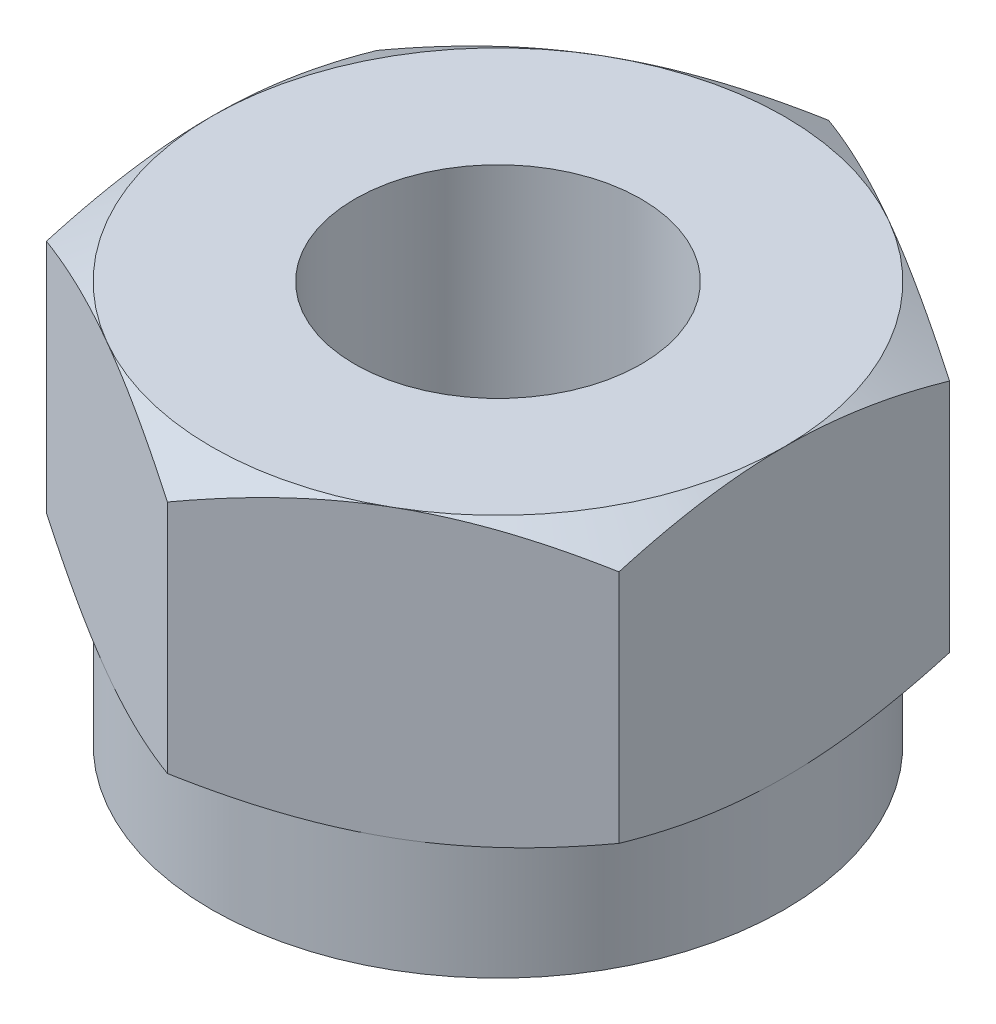
ISO-10303-21;
HEADER;
FILE_DESCRIPTION(('STEP AP214'),'2;1');
FILE_NAME('part.step','',(''),(''),'','','');
FILE_SCHEMA(('AUTOMOTIVE_DESIGN { 1 0 10303 214 1 1 1 1 }'));
ENDSEC;
DATA;
#1=APPLICATION_CONTEXT('core data for automotive mechanical design processes');
#2=APPLICATION_PROTOCOL_DEFINITION('international standard','automotive_design',2000,#1);
#3=PRODUCT_CONTEXT('',#1,'mechanical');
#4=PRODUCT('Part','Part','',(#3));
#5=PRODUCT_RELATED_PRODUCT_CATEGORY('part','',(#4));
#6=PRODUCT_DEFINITION_FORMATION('','',#4);
#7=PRODUCT_DEFINITION_CONTEXT('part definition',#1,'design');
#8=PRODUCT_DEFINITION('design','',#6,#7);
#9=PRODUCT_DEFINITION_SHAPE('','',#8);
#10=(LENGTH_UNIT() NAMED_UNIT(*) SI_UNIT(.MILLI.,.METRE.));
#11=(NAMED_UNIT(*) PLANE_ANGLE_UNIT() SI_UNIT($,.RADIAN.));
#12=(NAMED_UNIT(*) SI_UNIT($,.STERADIAN.) SOLID_ANGLE_UNIT());
#13=UNCERTAINTY_MEASURE_WITH_UNIT(LENGTH_MEASURE(1.E-05),#10,'distance_accuracy_value','');
#14=(GEOMETRIC_REPRESENTATION_CONTEXT(3) GLOBAL_UNCERTAINTY_ASSIGNED_CONTEXT((#13)) GLOBAL_UNIT_ASSIGNED_CONTEXT((#10,
#11,#12)) REPRESENTATION_CONTEXT('',''));
#15=CARTESIAN_POINT('',(0.,0.,0.));
#16=DIRECTION('',(0.,0.,1.));
#17=DIRECTION('',(1.,0.,0.));
#18=AXIS2_PLACEMENT_3D('',#15,#16,#17);
#19=CARTESIAN_POINT('',(2.,2.,1.15470053837925));
#20=DIRECTION('',(-1.,0.,0.));
#21=DIRECTION('',(0.,0.,1.));
#22=AXIS2_PLACEMENT_3D('',#19,#20,#21);
#23=PLANE('',#22);
#24=CARTESIAN_POINT('',(2.,0.97875609535379,-3.10723536669795));
#25=CARTESIAN_POINT('',(2.,0.936330863281514,-3.01982291812541));
#26=CARTESIAN_POINT('',(2.,0.894310863129675,-2.93221037868432));
#27=CARTESIAN_POINT('',(2.,0.811309168985699,-2.75647870830455));
#28=CARTESIAN_POINT('',(2.,0.770327637652085,-2.66835950062464));
#29=CARTESIAN_POINT('',(2.,0.689425807534132,-2.49105688438225));
#30=CARTESIAN_POINT('',(2.,0.649512450293482,-2.40187029751415));
#31=CARTESIAN_POINT('',(2.,0.571312094711017,-2.22278956259598));
#32=CARTESIAN_POINT('',(2.,0.533025019831961,-2.1328954480806));
#33=CARTESIAN_POINT('',(2.,0.457311353013554,-1.94935956339698));
#34=CARTESIAN_POINT('',(2.,0.419951688652782,-1.85569003279897));
#35=CARTESIAN_POINT('',(2.,0.34804642810297,-1.66725722614894));
#36=CARTESIAN_POINT('',(2.,0.313501146828968,-1.5724938290496));
#37=CARTESIAN_POINT('',(2.,0.248127262335514,-1.38189797826887));
#38=CARTESIAN_POINT('',(2.,0.217291190172754,-1.2860681123297));
#39=CARTESIAN_POINT('',(2.,0.160321349989198,-1.09303393166713));
#40=CARTESIAN_POINT('',(2.,0.134186107409679,-0.995830058298591));
#41=CARTESIAN_POINT('',(2.,0.0880046638202396,-0.800519631570152));
#42=CARTESIAN_POINT('',(2.,0.0679260461446227,-0.70242088760782));
#43=CARTESIAN_POINT('',(2.,0.0349927806511479,-0.504998657712038));
#44=CARTESIAN_POINT('',(2.,0.0221374160455011,-0.405675294301689));
#45=CARTESIAN_POINT('',(2.,0.00484760333100289,-0.207596358357077));
#46=CARTESIAN_POINT('',(2.,0.000304399834046033,-0.108850556253254));
#47=CARTESIAN_POINT('',(2.,-0.000274990538612941,0.0886636689890182));
#48=CARTESIAN_POINT('',(2.,0.00368903604231219,0.187432092632895));
#49=CARTESIAN_POINT('',(2.,0.0230279822384194,0.424007908884412));
#50=CARTESIAN_POINT('',(2.,0.0423603458053589,0.561494039208795));
#51=CARTESIAN_POINT('',(2.,0.0941420038497051,0.833973970245911));
#52=CARTESIAN_POINT('',(2.,0.126603821924047,0.968965262326356));
#53=CARTESIAN_POINT('',(2.,0.201944047933827,1.23927661555394));
#54=CARTESIAN_POINT('',(2.,0.245044073278131,1.37453334862926));
#55=CARTESIAN_POINT('',(2.,0.314931252091322,1.57552896046736));
#56=CARTESIAN_POINT('',(2.,0.339097251369915,1.64220624190891));
#57=CARTESIAN_POINT('',(2.,0.388899908545845,1.77500960503274));
#58=CARTESIAN_POINT('',(2.,0.414536540487428,1.84113569641962));
#59=CARTESIAN_POINT('',(2.,0.481768746671531,2.00988825558346));
#60=CARTESIAN_POINT('',(2.,0.524243277022574,2.11216361199275));
#61=CARTESIAN_POINT('',(2.,0.61146610883818,2.31574315029396));
#62=CARTESIAN_POINT('',(2.,0.656214597629618,2.41704725135485));
#63=CARTESIAN_POINT('',(2.,0.793084875117166,2.71983538558203));
#64=CARTESIAN_POINT('',(2.,0.887808948944017,2.92014047757868));
#65=CARTESIAN_POINT('',(2.,1.08164958392909,3.31892342327748));
#66=CARTESIAN_POINT('',(2.,1.18077193970127,3.51739842372691));
#67=CARTESIAN_POINT('',(2.,1.38182194195776,3.91287779107638));
#68=CARTESIAN_POINT('',(2.,1.48374912223979,4.10988239553973));
#69=CARTESIAN_POINT('',(2.,1.67962496570404,4.4839452837697));
#70=CARTESIAN_POINT('',(2.,1.77339629282093,4.66109678031435));
#71=CARTESIAN_POINT('',(2.,1.96210959646804,5.01478564375816));
#72=CARTESIAN_POINT('',(2.,2.05705162974282,5.19132298035281));
#73=CARTESIAN_POINT('',(2.,2.24753342568951,5.54340746049773));
#74=CARTESIAN_POINT('',(2.,2.34307063018964,5.71895599006594));
#75=CARTESIAN_POINT('',(2.,2.53482345307692,6.06966713410512));
#76=CARTESIAN_POINT('',(2.,2.63103902593319,6.24482977345991));
#77=CARTESIAN_POINT('',(2.,2.72750366307915,6.41985423397319));
#78=B_SPLINE_CURVE_WITH_KNOTS('',3,(#24,#25,#26,#27,#28,#29,#30,#31,#32,#33,#34,#35,#36,#37,#38,
#39,#40,#41,#42,#43,#44,#45,#46,#47,#48,#49,#50,#51,#52,#53,#54,#55,#56,#57,#58,#59,#60,#61,#62,
#63,#64,#65,#66,#67,#68,#69,#70,#71,#72,#73,#74,#75,#76,#77),.UNSPECIFIED.,.F.,.F.,(4,2,2,2,2,2,
2,2,2,2,2,2,2,2,2,2,2,2,2,2,2,2,2,2,2,2,4),(0.,0.291495438242345,0.583036255555676,
0.876154468354256,1.16925887089875,1.47175908403472,1.77429309903688,2.07620734835897,
2.37802672726573,2.67820079164995,2.9783450634853,3.27453340244007,3.57072917320313,
3.98638730647848,4.40244285594601,4.828030774266,5.04078368912382,5.25353285017925,
5.58572764746253,5.91794985519123,6.58257182839213,7.24809704982038,7.91351231168527,
8.51482375441764,9.11616445840593,9.7157475317989,10.3152907382448),.UNSPECIFIED.);
#79=CARTESIAN_POINT('',(2.,0.178632794953898,-1.15470053837953));
#80=VERTEX_POINT('',#79);
#81=CARTESIAN_POINT('',(2.,0.,0.));
#82=VERTEX_POINT('',#81);
#83=EDGE_CURVE('E156',#80,#82,#78,.T.);
#84=ORIENTED_EDGE('',*,*,#83,.F.);
#85=DIRECTION('',(0.,-1.,0.));
#86=VECTOR('',#85,1.);
#87=CARTESIAN_POINT('',(2.,2.,-1.15470053837925));
#88=LINE('',#87,#86);
#89=CARTESIAN_POINT('',(2.,1.82136720504592,-1.15470053837925));
#90=VERTEX_POINT('',#89);
#91=EDGE_CURVE('E164',#90,#80,#88,.T.);
#92=ORIENTED_EDGE('',*,*,#91,.F.);
#93=CARTESIAN_POINT('',(2.,1.02124390464623,-3.10723536669795));
#94=CARTESIAN_POINT('',(2.,1.0636691367185,-3.01982291812541));
#95=CARTESIAN_POINT('',(2.,1.10568913687034,-2.93221037868432));
#96=CARTESIAN_POINT('',(2.,1.18869083101432,-2.75647870830454));
#97=CARTESIAN_POINT('',(2.,1.22967236234793,-2.66835950062463));
#98=CARTESIAN_POINT('',(2.,1.31057419246588,-2.49105688438224));
#99=CARTESIAN_POINT('',(2.,1.35048754970653,-2.40187029751414));
#100=CARTESIAN_POINT('',(2.,1.42868790528899,-2.22278956259597));
#101=CARTESIAN_POINT('',(2.,1.46697498016805,-2.1328954480806));
#102=CARTESIAN_POINT('',(2.,1.54268864698646,-1.94935956339698));
#103=CARTESIAN_POINT('',(2.,1.58004831134723,-1.85569003279897));
#104=CARTESIAN_POINT('',(2.,1.65195357189704,-1.66725722614894));
#105=CARTESIAN_POINT('',(2.,1.68649885317104,-1.5724938290496));
#106=CARTESIAN_POINT('',(2.,1.75187273766449,-1.38189797826887));
#107=CARTESIAN_POINT('',(2.,1.78270880982725,-1.2860681123297));
#108=CARTESIAN_POINT('',(2.,1.83967865001081,-1.09303393166713));
#109=CARTESIAN_POINT('',(2.,1.86581389259032,-0.995830058298589));
#110=CARTESIAN_POINT('',(2.,1.91199533617976,-0.80051963157015));
#111=CARTESIAN_POINT('',(2.,1.93207395385538,-0.702420887607818));
#112=CARTESIAN_POINT('',(2.,1.96500721934885,-0.504998657712038));
#113=CARTESIAN_POINT('',(2.,1.9778625839545,-0.405675294301688));
#114=CARTESIAN_POINT('',(2.,1.995152396669,-0.207596358357078));
#115=CARTESIAN_POINT('',(2.,1.99969560016595,-0.108850556253255));
#116=CARTESIAN_POINT('',(2.,2.00027499053861,0.0886636689890171));
#117=CARTESIAN_POINT('',(2.,1.99631096395769,0.187432092632894));
#118=CARTESIAN_POINT('',(2.,1.97697201776158,0.424007908884413));
#119=CARTESIAN_POINT('',(2.,1.95763965419464,0.561494039208799));
#120=CARTESIAN_POINT('',(2.,1.90585799615029,0.83397397024592));
#121=CARTESIAN_POINT('',(2.,1.87339617807595,0.968965262326369));
#122=CARTESIAN_POINT('',(2.,1.79805595206617,1.23927661555396));
#123=CARTESIAN_POINT('',(2.,1.75495592672187,1.37453334862928));
#124=CARTESIAN_POINT('',(2.,1.68506874790868,1.57552896046739));
#125=CARTESIAN_POINT('',(2.,1.66090274863008,1.64220624190893));
#126=CARTESIAN_POINT('',(2.,1.61110009145415,1.77500960503277));
#127=CARTESIAN_POINT('',(2.,1.58546345951257,1.84113569641965));
#128=CARTESIAN_POINT('',(2.,1.51823125332846,2.00988825558349));
#129=CARTESIAN_POINT('',(2.,1.47575672297742,2.11216361199278));
#130=CARTESIAN_POINT('',(2.,1.38853389116182,2.31574315029399));
#131=CARTESIAN_POINT('',(2.,1.34378540237038,2.41704725135488));
#132=CARTESIAN_POINT('',(2.,1.20691512488283,2.71983538558206));
#133=CARTESIAN_POINT('',(2.,1.11219105105598,2.92014047757871));
#134=CARTESIAN_POINT('',(2.,0.918350416070918,3.31892342327751));
#135=CARTESIAN_POINT('',(2.,0.819228060298739,3.51739842372694));
#136=CARTESIAN_POINT('',(2.,0.618178058042255,3.91287779107641));
#137=CARTESIAN_POINT('',(2.,0.516250877760225,4.10988239553976));
#138=CARTESIAN_POINT('',(2.,0.320375034295979,4.48394528376973));
#139=CARTESIAN_POINT('',(2.,0.226603707179088,4.66109678031438));
#140=CARTESIAN_POINT('',(2.,0.0378904035319758,5.01478564375819));
#141=CARTESIAN_POINT('',(2.,-0.0570516297427976,5.19132298035284));
#142=CARTESIAN_POINT('',(2.,-0.247533425689486,5.54340746049777));
#143=CARTESIAN_POINT('',(2.,-0.343070630189615,5.71895599006598));
#144=CARTESIAN_POINT('',(2.,-0.53482345307689,6.06966713410516));
#145=CARTESIAN_POINT('',(2.,-0.631039025933164,6.24482977345994));
#146=CARTESIAN_POINT('',(2.,-0.727503663079119,6.41985423397323));
#147=B_SPLINE_CURVE_WITH_KNOTS('',3,(#93,#94,#95,#96,#97,#98,#99,#100,#101,#102,#103,#104,#105,
#106,#107,#108,#109,#110,#111,#112,#113,#114,#115,#116,#117,#118,#119,#120,#121,#122,#123,#124,
#125,#126,#127,#128,#129,#130,#131,#132,#133,#134,#135,#136,#137,#138,#139,#140,#141,#142,#143,
#144,#145,#146),.UNSPECIFIED.,.F.,.F.,(4,2,2,2,2,2,2,2,2,2,2,2,2,2,2,2,2,2,2,2,2,2,2,2,2,2,4),
(0.,0.291495438242345,0.583036255555675,0.876154468354256,1.16925887089875,1.47175908403472,
1.77429309903687,2.07620734835897,2.37802672726572,2.67820079164995,2.97834506348529,
3.27453340244006,3.57072917320312,3.98638730647848,4.40244285594602,4.82803077426602,
5.04078368912384,5.25353285017927,5.58572764746255,5.91794985519125,6.58257182839215,
7.24809704982039,7.91351231168528,8.51482375441766,9.11616445840594,9.71574753179892,
10.3152907382448),.UNSPECIFIED.);
#148=CARTESIAN_POINT('',(2.,2.,0.));
#149=VERTEX_POINT('',#148);
#150=EDGE_CURVE('E331',#149,#90,#147,.F.);
#151=ORIENTED_EDGE('',*,*,#150,.F.);
#152=CARTESIAN_POINT('',(2.,1.82136720504592,1.15470053837925));
#153=VERTEX_POINT('',#152);
#154=EDGE_CURVE('E327',#153,#149,#147,.F.);
#155=ORIENTED_EDGE('',*,*,#154,.F.);
#156=DIRECTION('',(0.,-1.,0.));
#157=VECTOR('',#156,1.);
#158=CARTESIAN_POINT('',(2.,2.,1.15470053837925));
#159=LINE('',#158,#157);
#160=CARTESIAN_POINT('',(2.,0.178632794954082,1.15470053837925));
#161=VERTEX_POINT('',#160);
#162=EDGE_CURVE('E257',#153,#161,#159,.T.);
#163=ORIENTED_EDGE('',*,*,#162,.T.);
#164=EDGE_CURVE('E218',#82,#161,#78,.T.);
#165=ORIENTED_EDGE('',*,*,#164,.F.);
#166=EDGE_LOOP('',(#84,#92,#151,#155,#163,#165));
#167=FACE_BOUND('',#166,.T.);
#168=ADVANCED_FACE('F46',(#167),#23,.F.);
#169=CARTESIAN_POINT('',(2.,2.,-1.15470053837925));
#170=DIRECTION('',(-0.5,0.,0.866025403784439));
#171=DIRECTION('',(0.866025403784439,0.,0.5));
#172=AXIS2_PLACEMENT_3D('',#169,#170,#171);
#173=PLANE('',#172);
#174=CARTESIAN_POINT('',(-0.000199999999999433,0.1786994666205,-2.30951654681234));
#175=CARTESIAN_POINT('',(0.0876912629000607,0.14938953610068,-2.25877250251758));
#176=CARTESIAN_POINT('',(0.176341194473592,0.122732851980468,-2.20759044065996));
#177=CARTESIAN_POINT('',(0.355176246997803,0.0762024910207222,-2.10433997494456));
#178=CARTESIAN_POINT('',(0.445364546505038,0.0563452763827801,-2.05226973594631));
#179=CARTESIAN_POINT('',(0.624623385763307,0.0254334640232533,-1.94877459684592));
#180=CARTESIAN_POINT('',(0.713666338226305,0.0141731515985318,-1.89736562427197));
#181=CARTESIAN_POINT('',(0.892171397785045,0.000728662594642533,-1.79430568008402));
#182=CARTESIAN_POINT('',(0.98163285570396,-0.00146664504653107,-1.74265508327244));
#183=CARTESIAN_POINT('',(1.1488083535488,0.00309098933064973,-1.64613626458981));
#184=CARTESIAN_POINT('',(1.22654737026578,0.00872487468701561,-1.60125362236173));
#185=CARTESIAN_POINT('',(1.38151891453613,0.0265838952608295,-1.51178075956051));
#186=CARTESIAN_POINT('',(1.4587509057412,0.0388151360234405,-1.46719084864821));
#187=CARTESIAN_POINT('',(1.6140421864822,0.069393436867611,-1.37753338590959));
#188=CARTESIAN_POINT('',(1.69208181310738,0.0878701670657172,-1.33247718647009));
#189=CARTESIAN_POINT('',(1.84699686569214,0.129805518212857,-1.24303693915876));
#190=CARTESIAN_POINT('',(1.92387427762312,0.153254280492315,-1.1986517446858));
#191=CARTESIAN_POINT('',(2.0002,0.1786994666205,-1.15458506832542));
#192=B_SPLINE_CURVE_WITH_KNOTS('',3,(#174,#175,#176,#177,#178,#179,#180,#181,#182,#183,#184,
#185,#186,#187,#188,#189,#190,#191),.UNSPECIFIED.,.F.,.F.,(4,2,2,2,2,2,2,2,4),(0.,
0.31703182469561,0.634825876346564,0.944753967652637,1.25430138000371,1.52387047293094,
1.79368946861028,2.06949491027634,2.34475850821472),.UNSPECIFIED.);
#193=CARTESIAN_POINT('',(0.,0.178632794954083,-2.3094010767585));
#194=VERTEX_POINT('',#193);
#195=CARTESIAN_POINT('',(1.,0.,-1.73205080756888));
#196=VERTEX_POINT('',#195);
#197=EDGE_CURVE('E143',#194,#196,#192,.T.);
#198=ORIENTED_EDGE('',*,*,#197,.F.);
#199=DIRECTION('',(0.,-1.,0.));
#200=VECTOR('',#199,1.);
#201=CARTESIAN_POINT('',(0.,2.,-2.3094010767585));
#202=LINE('',#201,#200);
#203=CARTESIAN_POINT('',(0.,1.82136720504592,-2.3094010767585));
#204=VERTEX_POINT('',#203);
#205=EDGE_CURVE('E254',#204,#194,#202,.T.);
#206=ORIENTED_EDGE('',*,*,#205,.F.);
#207=CARTESIAN_POINT('',(2.0002,1.8213005333795,-1.15458506832542));
#208=CARTESIAN_POINT('',(1.91230873709994,1.85061046389932,-1.20532911262018));
#209=CARTESIAN_POINT('',(1.82365880552641,1.87726714801953,-1.2565111744778));
#210=CARTESIAN_POINT('',(1.6448237530022,1.92379750897928,-1.3597616401932));
#211=CARTESIAN_POINT('',(1.55463545349496,1.94365472361722,-1.41183187919145));
#212=CARTESIAN_POINT('',(1.37537661423669,1.97456653597675,-1.51532701829183));
#213=CARTESIAN_POINT('',(1.2863336617737,1.98582684840147,-1.56673599086578));
#214=CARTESIAN_POINT('',(1.10782860221496,1.99927133740536,-1.66979593505373));
#215=CARTESIAN_POINT('',(1.01836714429604,2.00146664504653,-1.72144653186531));
#216=CARTESIAN_POINT('',(0.851191646451203,1.99690901066935,-1.81796535054794));
#217=CARTESIAN_POINT('',(0.773452629734217,1.99127512531298,-1.86284799277603));
#218=CARTESIAN_POINT('',(0.618481085463868,1.97341610473917,-1.95232085557725));
#219=CARTESIAN_POINT('',(0.541249094258803,1.96118486397656,-1.99691076648954));
#220=CARTESIAN_POINT('',(0.3859578135178,1.93060656313239,-2.08656822922816));
#221=CARTESIAN_POINT('',(0.307918186892621,1.91212983293428,-2.13162442866767));
#222=CARTESIAN_POINT('',(0.153003134307866,1.87019448178714,-2.221064675979));
#223=CARTESIAN_POINT('',(0.0761257223768805,1.84674571950769,-2.26544987045196));
#224=CARTESIAN_POINT('',(-0.000199999999999633,1.8213005333795,-2.30951654681234));
#225=B_SPLINE_CURVE_WITH_KNOTS('',3,(#207,#208,#209,#210,#211,#212,#213,#214,#215,#216,#217,
#218,#219,#220,#221,#222,#223,#224),.UNSPECIFIED.,.F.,.F.,(4,2,2,2,2,2,2,2,4),(0.,
0.317031824695609,0.634825876346562,0.944753967652634,1.25430138000371,1.52387047293094,
1.79368946861028,2.06949491027634,2.34475850821472),.UNSPECIFIED.);
#226=CARTESIAN_POINT('',(1.,2.,-1.73205080756888));
#227=VERTEX_POINT('',#226);
#228=EDGE_CURVE('E301',#227,#204,#225,.T.);
#229=ORIENTED_EDGE('',*,*,#228,.F.);
#230=EDGE_CURVE('E336',#90,#227,#225,.T.);
#231=ORIENTED_EDGE('',*,*,#230,.F.);
#232=ORIENTED_EDGE('',*,*,#91,.T.);
#233=EDGE_CURVE('E151',#196,#80,#192,.T.);
#234=ORIENTED_EDGE('',*,*,#233,.F.);
#235=EDGE_LOOP('',(#198,#206,#229,#231,#232,#234));
#236=FACE_BOUND('',#235,.T.);
#237=ADVANCED_FACE('F161',(#236),#173,.F.);
#238=CARTESIAN_POINT('',(0.,2.,-2.3094010767585));
#239=DIRECTION('',(0.5,0.,0.866025403784439));
#240=DIRECTION('',(0.866025403784439,0.,-0.5));
#241=AXIS2_PLACEMENT_3D('',#238,#239,#240);
#242=PLANE('',#241);
#243=CARTESIAN_POINT('',(-2.0002,0.178699466620499,-1.15458506832542));
#244=CARTESIAN_POINT('',(-1.91230873709994,0.14938953610068,-1.20532911262018));
#245=CARTESIAN_POINT('',(-1.82365880552641,0.122732851980468,-1.2565111744778));
#246=CARTESIAN_POINT('',(-1.6448237530022,0.076202491020722,-1.3597616401932));
#247=CARTESIAN_POINT('',(-1.55463545349496,0.0563452763827801,-1.41183187919145));
#248=CARTESIAN_POINT('',(-1.37537661423669,0.0254334640232533,-1.51532701829183));
#249=CARTESIAN_POINT('',(-1.28633366177369,0.0141731515985318,-1.56673599086579));
#250=CARTESIAN_POINT('',(-1.10782860221496,0.000728662594642524,-1.66979593505373));
#251=CARTESIAN_POINT('',(-1.01836714429604,-0.00146664504653108,-1.72144653186532));
#252=CARTESIAN_POINT('',(-0.8511916464512,0.00309098933064962,-1.81796535054794));
#253=CARTESIAN_POINT('',(-0.773452629734215,0.00872487468701541,-1.86284799277603));
#254=CARTESIAN_POINT('',(-0.618481085463865,0.0265838952608294,-1.95232085557725));
#255=CARTESIAN_POINT('',(-0.5412490942588,0.0388151360234407,-1.99691076648955));
#256=CARTESIAN_POINT('',(-0.385957813517798,0.0693934368676114,-2.08656822922816));
#257=CARTESIAN_POINT('',(-0.307918186892619,0.0878701670657174,-2.13162442866767));
#258=CARTESIAN_POINT('',(-0.153003134307864,0.129805518212857,-2.221064675979));
#259=CARTESIAN_POINT('',(-0.0761257223768793,0.153254280492315,-2.26544987045196));
#260=CARTESIAN_POINT('',(0.000200000000000403,0.1786994666205,-2.30951654681234));
#261=B_SPLINE_CURVE_WITH_KNOTS('',3,(#243,#244,#245,#246,#247,#248,#249,#250,#251,#252,#253,
#254,#255,#256,#257,#258,#259,#260),.UNSPECIFIED.,.F.,.F.,(4,2,2,2,2,2,2,2,4),(0.,
0.31703182469561,0.634825876346564,0.944753967652637,1.25430138000371,1.52387047293094,
1.79368946861028,2.06949491027634,2.34475850821472),.UNSPECIFIED.);
#262=CARTESIAN_POINT('',(-2.,0.178632794953898,-1.15470053837953));
#263=VERTEX_POINT('',#262);
#264=CARTESIAN_POINT('',(-0.999999999999999,0.,-1.73205080756888));
#265=VERTEX_POINT('',#264);
#266=EDGE_CURVE('E353',#263,#265,#261,.T.);
#267=ORIENTED_EDGE('',*,*,#266,.F.);
#268=DIRECTION('',(0.,-1.,0.));
#269=VECTOR('',#268,1.);
#270=CARTESIAN_POINT('',(-2.,2.,-1.15470053837925));
#271=LINE('',#270,#269);
#272=CARTESIAN_POINT('',(-2.,1.8213672050461,-1.15470053837953));
#273=VERTEX_POINT('',#272);
#274=EDGE_CURVE('E251',#273,#263,#271,.T.);
#275=ORIENTED_EDGE('',*,*,#274,.F.);
#276=CARTESIAN_POINT('',(0.000200000000000494,1.8213005333795,-2.30951654681234));
#277=CARTESIAN_POINT('',(-0.0876912629000593,1.85061046389932,-2.25877250251758));
#278=CARTESIAN_POINT('',(-0.176341194473591,1.87726714801953,-2.20759044065996));
#279=CARTESIAN_POINT('',(-0.355176246997801,1.92379750897928,-2.10433997494456));
#280=CARTESIAN_POINT('',(-0.445364546505036,1.94365472361722,-2.05226973594631));
#281=CARTESIAN_POINT('',(-0.624623385763305,1.97456653597675,-1.94877459684592));
#282=CARTESIAN_POINT('',(-0.713666338226303,1.98582684840147,-1.89736562427197));
#283=CARTESIAN_POINT('',(-0.892171397785042,1.99927133740536,-1.79430568008403));
#284=CARTESIAN_POINT('',(-0.981632855703957,2.00146664504653,-1.74265508327244));
#285=CARTESIAN_POINT('',(-1.1488083535488,1.99690901066935,-1.64613626458982));
#286=CARTESIAN_POINT('',(-1.22654737026578,1.99127512531299,-1.60125362236173));
#287=CARTESIAN_POINT('',(-1.38151891453613,1.97341610473917,-1.51178075956051));
#288=CARTESIAN_POINT('',(-1.4587509057412,1.96118486397656,-1.46719084864821));
#289=CARTESIAN_POINT('',(-1.6140421864822,1.93060656313239,-1.37753338590959));
#290=CARTESIAN_POINT('',(-1.69208181310738,1.91212983293428,-1.33247718647009));
#291=CARTESIAN_POINT('',(-1.84699686569213,1.87019448178715,-1.24303693915876));
#292=CARTESIAN_POINT('',(-1.92387427762312,1.84674571950769,-1.1986517446858));
#293=CARTESIAN_POINT('',(-2.0002,1.8213005333795,-1.15458506832542));
#294=B_SPLINE_CURVE_WITH_KNOTS('',3,(#276,#277,#278,#279,#280,#281,#282,#283,#284,#285,#286,
#287,#288,#289,#290,#291,#292,#293),.UNSPECIFIED.,.F.,.F.,(4,2,2,2,2,2,2,2,4),(0.,
0.31703182469561,0.634825876346563,0.944753967652634,1.25430138000371,1.52387047293094,
1.79368946861028,2.06949491027634,2.34475850821472),.UNSPECIFIED.);
#295=CARTESIAN_POINT('',(-1.,2.,-1.73205080756888));
#296=VERTEX_POINT('',#295);
#297=EDGE_CURVE('E294',#296,#273,#294,.T.);
#298=ORIENTED_EDGE('',*,*,#297,.F.);
#299=EDGE_CURVE('E300',#204,#296,#294,.T.);
#300=ORIENTED_EDGE('',*,*,#299,.F.);
#301=ORIENTED_EDGE('',*,*,#205,.T.);
#302=EDGE_CURVE('E145',#265,#194,#261,.T.);
#303=ORIENTED_EDGE('',*,*,#302,.F.);
#304=EDGE_LOOP('',(#267,#275,#298,#300,#301,#303));
#305=FACE_BOUND('',#304,.T.);
#306=ADVANCED_FACE('F307',(#305),#242,.F.);
#307=CARTESIAN_POINT('',(-2.,2.,-1.15470053837925));
#308=DIRECTION('',(1.,0.,0.));
#309=DIRECTION('',(0.,0.,-1.));
#310=AXIS2_PLACEMENT_3D('',#307,#308,#309);
#311=PLANE('',#310);
#312=CARTESIAN_POINT('',(-2.,0.97875609535379,-3.10723536669795));
#313=CARTESIAN_POINT('',(-2.,0.936330863281513,-3.01982291812541));
#314=CARTESIAN_POINT('',(-2.,0.894310863129675,-2.93221037868432));
#315=CARTESIAN_POINT('',(-2.,0.811309168985699,-2.75647870830455));
#316=CARTESIAN_POINT('',(-2.,0.770327637652085,-2.66835950062464));
#317=CARTESIAN_POINT('',(-2.,0.689425807534131,-2.49105688438225));
#318=CARTESIAN_POINT('',(-2.,0.649512450293482,-2.40187029751415));
#319=CARTESIAN_POINT('',(-2.,0.571312094711017,-2.22278956259598));
#320=CARTESIAN_POINT('',(-2.,0.53302501983196,-2.1328954480806));
#321=CARTESIAN_POINT('',(-2.,0.457311353013553,-1.94935956339698));
#322=CARTESIAN_POINT('',(-2.,0.419951688652781,-1.85569003279897));
#323=CARTESIAN_POINT('',(-2.,0.348046428102969,-1.66725722614894));
#324=CARTESIAN_POINT('',(-2.,0.313501146828967,-1.5724938290496));
#325=CARTESIAN_POINT('',(-2.,0.248127262335514,-1.38189797826887));
#326=CARTESIAN_POINT('',(-2.,0.217291190172754,-1.2860681123297));
#327=CARTESIAN_POINT('',(-2.,0.160321349989198,-1.09303393166713));
#328=CARTESIAN_POINT('',(-2.,0.134186107409679,-0.995830058298591));
#329=CARTESIAN_POINT('',(-2.,0.0880046638202393,-0.800519631570152));
#330=CARTESIAN_POINT('',(-2.,0.0679260461446225,-0.70242088760782));
#331=CARTESIAN_POINT('',(-2.,0.0349927806511475,-0.504998657712039));
#332=CARTESIAN_POINT('',(-2.,0.0221374160455005,-0.405675294301689));
#333=CARTESIAN_POINT('',(-2.,0.00484760333100222,-0.207596358357077));
#334=CARTESIAN_POINT('',(-2.,0.000304399834045393,-0.108850556253255));
#335=CARTESIAN_POINT('',(-2.,-0.000274990538613551,0.0886636689890179));
#336=CARTESIAN_POINT('',(-2.,0.00368903604231156,0.187432092632895));
#337=CARTESIAN_POINT('',(-2.,0.0230279822384187,0.424007908884411));
#338=CARTESIAN_POINT('',(-2.,0.0423603458053582,0.561494039208794));
#339=CARTESIAN_POINT('',(-2.,0.0941420038497043,0.83397397024591));
#340=CARTESIAN_POINT('',(-2.,0.126603821924046,0.968965262326356));
#341=CARTESIAN_POINT('',(-2.,0.201944047933826,1.23927661555394));
#342=CARTESIAN_POINT('',(-2.,0.24504407327813,1.37453334862926));
#343=CARTESIAN_POINT('',(-2.,0.314931252091321,1.57552896046736));
#344=CARTESIAN_POINT('',(-2.,0.339097251369914,1.64220624190891));
#345=CARTESIAN_POINT('',(-2.,0.388899908545844,1.77500960503274));
#346=CARTESIAN_POINT('',(-2.,0.414536540487426,1.84113569641962));
#347=CARTESIAN_POINT('',(-2.,0.481768746671529,2.00988825558346));
#348=CARTESIAN_POINT('',(-2.,0.524243277022572,2.11216361199275));
#349=CARTESIAN_POINT('',(-2.,0.611466108838178,2.31574315029395));
#350=CARTESIAN_POINT('',(-2.,0.656214597629617,2.41704725135485));
#351=CARTESIAN_POINT('',(-2.,0.793084875117165,2.71983538558203));
#352=CARTESIAN_POINT('',(-2.,0.887808948944015,2.92014047757867));
#353=CARTESIAN_POINT('',(-2.,1.08164958392908,3.31892342327748));
#354=CARTESIAN_POINT('',(-2.,1.18077193970127,3.51739842372691));
#355=CARTESIAN_POINT('',(-2.,1.38182194195775,3.91287779107638));
#356=CARTESIAN_POINT('',(-2.,1.48374912223978,4.10988239553973));
#357=CARTESIAN_POINT('',(-2.,1.67962496570403,4.4839452837697));
#358=CARTESIAN_POINT('',(-2.,1.77339629282093,4.66109678031435));
#359=CARTESIAN_POINT('',(-2.,1.96210959646804,5.01478564375816));
#360=CARTESIAN_POINT('',(-2.,2.05705162974282,5.19132298035281));
#361=CARTESIAN_POINT('',(-2.,2.24753342568951,5.54340746049773));
#362=CARTESIAN_POINT('',(-2.,2.34307063018964,5.71895599006594));
#363=CARTESIAN_POINT('',(-2.,2.53482345307691,6.06966713410512));
#364=CARTESIAN_POINT('',(-2.,2.63103902593319,6.24482977345991));
#365=CARTESIAN_POINT('',(-2.,2.72750366307915,6.41985423397319));
#366=B_SPLINE_CURVE_WITH_KNOTS('',3,(#312,#313,#314,#315,#316,#317,#318,#319,#320,#321,#322,
#323,#324,#325,#326,#327,#328,#329,#330,#331,#332,#333,#334,#335,#336,#337,#338,#339,#340,#341,
#342,#343,#344,#345,#346,#347,#348,#349,#350,#351,#352,#353,#354,#355,#356,#357,#358,#359,#360,
#361,#362,#363,#364,#365),.UNSPECIFIED.,.F.,.F.,(4,2,2,2,2,2,2,2,2,2,2,2,2,2,2,2,2,2,2,2,2,2,2,
2,2,2,4),(0.,0.291495438242346,0.583036255555676,0.876154468354257,1.16925887089875,
1.47175908403472,1.77429309903688,2.07620734835897,2.37802672726573,2.67820079164995,
2.9783450634853,3.27453340244007,3.57072917320313,3.98638730647848,4.40244285594601,
4.828030774266,5.04078368912382,5.25353285017925,5.58572764746252,5.91794985519123,
6.58257182839213,7.24809704982037,7.91351231168527,8.51482375441764,9.11616445840593,
9.7157475317989,10.3152907382448),.UNSPECIFIED.);
#367=CARTESIAN_POINT('',(-2.,0.178632794954081,1.15470053837925));
#368=VERTEX_POINT('',#367);
#369=CARTESIAN_POINT('',(-2.,0.,0.));
#370=VERTEX_POINT('',#369);
#371=EDGE_CURVE('E165',#368,#370,#366,.F.);
#372=ORIENTED_EDGE('',*,*,#371,.F.);
#373=DIRECTION('',(0.,-1.,0.));
#374=VECTOR('',#373,1.);
#375=CARTESIAN_POINT('',(-2.,2.,1.15470053837925));
#376=LINE('',#375,#374);
#377=CARTESIAN_POINT('',(-2.,1.82136720504592,1.15470053837925));
#378=VERTEX_POINT('',#377);
#379=EDGE_CURVE('E244',#378,#368,#376,.T.);
#380=ORIENTED_EDGE('',*,*,#379,.F.);
#381=CARTESIAN_POINT('',(-2.,1.02124390464623,-3.10723536669795));
#382=CARTESIAN_POINT('',(-2.,1.0636691367185,-3.01982291812541));
#383=CARTESIAN_POINT('',(-2.,1.10568913687034,-2.93221037868432));
#384=CARTESIAN_POINT('',(-2.,1.18869083101432,-2.75647870830454));
#385=CARTESIAN_POINT('',(-2.,1.22967236234793,-2.66835950062463));
#386=CARTESIAN_POINT('',(-2.,1.31057419246588,-2.49105688438224));
#387=CARTESIAN_POINT('',(-2.,1.35048754970653,-2.40187029751414));
#388=CARTESIAN_POINT('',(-2.,1.42868790528899,-2.22278956259597));
#389=CARTESIAN_POINT('',(-2.,1.46697498016805,-2.1328954480806));
#390=CARTESIAN_POINT('',(-2.,1.54268864698646,-1.94935956339698));
#391=CARTESIAN_POINT('',(-2.,1.58004831134723,-1.85569003279897));
#392=CARTESIAN_POINT('',(-2.,1.65195357189704,-1.66725722614894));
#393=CARTESIAN_POINT('',(-2.,1.68649885317104,-1.5724938290496));
#394=CARTESIAN_POINT('',(-2.,1.75187273766449,-1.38189797826887));
#395=CARTESIAN_POINT('',(-2.,1.78270880982725,-1.2860681123297));
#396=CARTESIAN_POINT('',(-2.,1.83967865001081,-1.09303393166713));
#397=CARTESIAN_POINT('',(-2.,1.86581389259032,-0.99583005829859));
#398=CARTESIAN_POINT('',(-2.,1.91199533617976,-0.800519631570151));
#399=CARTESIAN_POINT('',(-2.,1.93207395385538,-0.70242088760782));
#400=CARTESIAN_POINT('',(-2.,1.96500721934885,-0.504998657712039));
#401=CARTESIAN_POINT('',(-2.,1.9778625839545,-0.40567529430169));
#402=CARTESIAN_POINT('',(-2.,1.995152396669,-0.207596358357079));
#403=CARTESIAN_POINT('',(-2.,1.99969560016595,-0.108850556253256));
#404=CARTESIAN_POINT('',(-2.,2.00027499053861,0.0886636689890163));
#405=CARTESIAN_POINT('',(-2.,1.99631096395769,0.187432092632893));
#406=CARTESIAN_POINT('',(-2.,1.97697201776158,0.424007908884413));
#407=CARTESIAN_POINT('',(-2.,1.95763965419464,0.561494039208798));
#408=CARTESIAN_POINT('',(-2.,1.9058579961503,0.833973970245919));
#409=CARTESIAN_POINT('',(-2.,1.87339617807595,0.968965262326368));
#410=CARTESIAN_POINT('',(-2.,1.79805595206617,1.23927661555396));
#411=CARTESIAN_POINT('',(-2.,1.75495592672187,1.37453334862928));
#412=CARTESIAN_POINT('',(-2.,1.68506874790868,1.57552896046739));
#413=CARTESIAN_POINT('',(-2.,1.66090274863008,1.64220624190893));
#414=CARTESIAN_POINT('',(-2.,1.61110009145415,1.77500960503277));
#415=CARTESIAN_POINT('',(-2.,1.58546345951257,1.84113569641965));
#416=CARTESIAN_POINT('',(-2.,1.51823125332847,2.00988825558349));
#417=CARTESIAN_POINT('',(-2.,1.47575672297742,2.11216361199278));
#418=CARTESIAN_POINT('',(-2.,1.38853389116182,2.31574315029399));
#419=CARTESIAN_POINT('',(-2.,1.34378540237038,2.41704725135488));
#420=CARTESIAN_POINT('',(-2.,1.20691512488284,2.71983538558206));
#421=CARTESIAN_POINT('',(-2.,1.11219105105599,2.9201404775787));
#422=CARTESIAN_POINT('',(-2.,0.918350416070919,3.31892342327751));
#423=CARTESIAN_POINT('',(-2.,0.819228060298741,3.51739842372694));
#424=CARTESIAN_POINT('',(-2.,0.618178058042256,3.91287779107641));
#425=CARTESIAN_POINT('',(-2.,0.516250877760227,4.10988239553976));
#426=CARTESIAN_POINT('',(-2.,0.32037503429598,4.48394528376973));
#427=CARTESIAN_POINT('',(-2.,0.226603707179089,4.66109678031438));
#428=CARTESIAN_POINT('',(-2.,0.0378904035319767,5.01478564375819));
#429=CARTESIAN_POINT('',(-2.,-0.0570516297427969,5.19132298035284));
#430=CARTESIAN_POINT('',(-2.,-0.247533425689485,5.54340746049777));
#431=CARTESIAN_POINT('',(-2.,-0.343070630189614,5.71895599006598));
#432=CARTESIAN_POINT('',(-2.,-0.534823453076889,6.06966713410516));
#433=CARTESIAN_POINT('',(-2.,-0.631039025933163,6.24482977345994));
#434=CARTESIAN_POINT('',(-2.,-0.727503663079118,6.41985423397323));
#435=B_SPLINE_CURVE_WITH_KNOTS('',3,(#381,#382,#383,#384,#385,#386,#387,#388,#389,#390,#391,
#392,#393,#394,#395,#396,#397,#398,#399,#400,#401,#402,#403,#404,#405,#406,#407,#408,#409,#410,
#411,#412,#413,#414,#415,#416,#417,#418,#419,#420,#421,#422,#423,#424,#425,#426,#427,#428,#429,
#430,#431,#432,#433,#434),.UNSPECIFIED.,.F.,.F.,(4,2,2,2,2,2,2,2,2,2,2,2,2,2,2,2,2,2,2,2,2,2,2,
2,2,2,4),(0.,0.291495438242345,0.583036255555675,0.876154468354256,1.16925887089875,
1.47175908403472,1.77429309903687,2.07620734835897,2.37802672726572,2.67820079164995,
2.97834506348529,3.27453340244006,3.57072917320312,3.98638730647848,4.40244285594602,
4.82803077426601,5.04078368912384,5.25353285017927,5.58572764746255,5.91794985519125,
6.58257182839215,7.24809704982039,7.91351231168528,8.51482375441766,9.11616445840594,
9.71574753179892,10.3152907382448),.UNSPECIFIED.);
#436=CARTESIAN_POINT('',(-2.,2.,0.));
#437=VERTEX_POINT('',#436);
#438=EDGE_CURVE('E287',#437,#378,#435,.T.);
#439=ORIENTED_EDGE('',*,*,#438,.F.);
#440=EDGE_CURVE('E293',#273,#437,#435,.T.);
#441=ORIENTED_EDGE('',*,*,#440,.F.);
#442=ORIENTED_EDGE('',*,*,#274,.T.);
#443=EDGE_CURVE('E150',#370,#263,#366,.F.);
#444=ORIENTED_EDGE('',*,*,#443,.F.);
#445=EDGE_LOOP('',(#372,#380,#439,#441,#442,#444));
#446=FACE_BOUND('',#445,.T.);
#447=ADVANCED_FACE('F242',(#446),#311,.F.);
#448=CARTESIAN_POINT('',(-2.,2.,1.15470053837925));
#449=DIRECTION('',(0.5,0.,-0.866025403784439));
#450=DIRECTION('',(-0.866025403784439,0.,-0.5));
#451=AXIS2_PLACEMENT_3D('',#448,#449,#450);
#452=PLANE('',#451);
#453=CARTESIAN_POINT('',(0.000200000000000053,0.178699466620498,2.30951654681234));
#454=CARTESIAN_POINT('',(-0.0876912629000602,0.14938953610068,2.25877250251757));
#455=CARTESIAN_POINT('',(-0.176341194473591,0.122732851980467,2.20759044065995));
#456=CARTESIAN_POINT('',(-0.355176246997802,0.0762024910207211,2.10433997494456));
#457=CARTESIAN_POINT('',(-0.445364546505037,0.0563452763827789,2.0522697359463));
#458=CARTESIAN_POINT('',(-0.624623385763306,0.0254334640232521,1.94877459684592));
#459=CARTESIAN_POINT('',(-0.713666338226304,0.0141731515985307,1.89736562427197));
#460=CARTESIAN_POINT('',(-0.892171397785043,0.000728662594641379,1.79430568008402));
#461=CARTESIAN_POINT('',(-0.981632855703958,-0.00146664504653243,1.74265508327244));
#462=CARTESIAN_POINT('',(-1.1488083535488,0.00309098933064817,1.64613626458981));
#463=CARTESIAN_POINT('',(-1.22654737026578,0.00872487468701406,1.60125362236172));
#464=CARTESIAN_POINT('',(-1.38151891453613,0.0265838952608281,1.51178075956051));
#465=CARTESIAN_POINT('',(-1.4587509057412,0.0388151360234393,1.46719084864821));
#466=CARTESIAN_POINT('',(-1.6140421864822,0.0693934368676099,1.37753338590959));
#467=CARTESIAN_POINT('',(-1.69208181310738,0.087870167065716,1.33247718647009));
#468=CARTESIAN_POINT('',(-1.84699686569213,0.129805518212856,1.24303693915875));
#469=CARTESIAN_POINT('',(-1.92387427762312,0.153254280492314,1.1986517446858));
#470=CARTESIAN_POINT('',(-2.0002,0.178699466620498,1.15458506832541));
#471=B_SPLINE_CURVE_WITH_KNOTS('',3,(#453,#454,#455,#456,#457,#458,#459,#460,#461,#462,#463,
#464,#465,#466,#467,#468,#469,#470),.UNSPECIFIED.,.F.,.F.,(4,2,2,2,2,2,2,2,4),(0.,
0.31703182469561,0.634825876346564,0.944753967652637,1.25430138000371,1.52387047293094,
1.79368946861028,2.06949491027634,2.34475850821472),.UNSPECIFIED.);
#472=CARTESIAN_POINT('',(0.,0.178632794954082,2.3094010767585));
#473=VERTEX_POINT('',#472);
#474=CARTESIAN_POINT('',(-1.,0.,1.73205080756888));
#475=VERTEX_POINT('',#474);
#476=EDGE_CURVE('E211',#473,#475,#471,.T.);
#477=ORIENTED_EDGE('',*,*,#476,.F.);
#478=DIRECTION('',(0.,-1.,0.));
#479=VECTOR('',#478,1.);
#480=CARTESIAN_POINT('',(0.,2.,2.3094010767585));
#481=LINE('',#480,#479);
#482=CARTESIAN_POINT('',(0.,1.82136720504592,2.3094010767585));
#483=VERTEX_POINT('',#482);
#484=EDGE_CURVE('E252',#483,#473,#481,.T.);
#485=ORIENTED_EDGE('',*,*,#484,.F.);
#486=CARTESIAN_POINT('',(-2.0002,1.8213005333795,1.15458506832541));
#487=CARTESIAN_POINT('',(-1.91230873709994,1.85061046389932,1.20532911262018));
#488=CARTESIAN_POINT('',(-1.82365880552641,1.87726714801954,1.2565111744778));
#489=CARTESIAN_POINT('',(-1.6448237530022,1.92379750897928,1.35976164019319));
#490=CARTESIAN_POINT('',(-1.55463545349496,1.94365472361722,1.41183187919145));
#491=CARTESIAN_POINT('',(-1.37537661423669,1.97456653597675,1.51532701829183));
#492=CARTESIAN_POINT('',(-1.2863336617737,1.98582684840147,1.56673599086578));
#493=CARTESIAN_POINT('',(-1.10782860221496,1.99927133740536,1.66979593505373));
#494=CARTESIAN_POINT('',(-1.01836714429604,2.00146664504653,1.72144653186531));
#495=CARTESIAN_POINT('',(-0.851191646451203,1.99690901066935,1.81796535054794));
#496=CARTESIAN_POINT('',(-0.773452629734217,1.99127512531299,1.86284799277603));
#497=CARTESIAN_POINT('',(-0.618481085463868,1.97341610473917,1.95232085557725));
#498=CARTESIAN_POINT('',(-0.541249094258802,1.96118486397656,1.99691076648954));
#499=CARTESIAN_POINT('',(-0.3859578135178,1.93060656313239,2.08656822922816));
#500=CARTESIAN_POINT('',(-0.307918186892621,1.91212983293429,2.13162442866767));
#501=CARTESIAN_POINT('',(-0.153003134307865,1.87019448178715,2.221064675979));
#502=CARTESIAN_POINT('',(-0.07612572237688,1.84674571950769,2.26544987045196));
#503=CARTESIAN_POINT('',(0.000200000000000083,1.8213005333795,2.30951654681234));
#504=B_SPLINE_CURVE_WITH_KNOTS('',3,(#486,#487,#488,#489,#490,#491,#492,#493,#494,#495,#496,
#497,#498,#499,#500,#501,#502,#503),.UNSPECIFIED.,.F.,.F.,(4,2,2,2,2,2,2,2,4),(0.,
0.317031824695609,0.634825876346562,0.944753967652634,1.25430138000371,1.52387047293094,
1.79368946861028,2.06949491027634,2.34475850821472),.UNSPECIFIED.);
#505=CARTESIAN_POINT('',(-1.,2.,1.73205080756888));
#506=VERTEX_POINT('',#505);
#507=EDGE_CURVE('E280',#506,#483,#504,.T.);
#508=ORIENTED_EDGE('',*,*,#507,.F.);
#509=EDGE_CURVE('E250',#378,#506,#504,.T.);
#510=ORIENTED_EDGE('',*,*,#509,.F.);
#511=ORIENTED_EDGE('',*,*,#379,.T.);
#512=EDGE_CURVE('E167',#475,#368,#471,.T.);
#513=ORIENTED_EDGE('',*,*,#512,.F.);
#514=EDGE_LOOP('',(#477,#485,#508,#510,#511,#513));
#515=FACE_BOUND('',#514,.T.);
#516=ADVANCED_FACE('F247',(#515),#452,.F.);
#517=CARTESIAN_POINT('',(0.,2.,2.3094010767585));
#518=DIRECTION('',(-0.5,0.,-0.866025403784439));
#519=DIRECTION('',(-0.866025403784439,0.,0.5));
#520=AXIS2_PLACEMENT_3D('',#517,#518,#519);
#521=PLANE('',#520);
#522=CARTESIAN_POINT('',(2.0002,0.178699466620499,1.15458506832541));
#523=CARTESIAN_POINT('',(1.91230873709994,0.14938953610068,1.20532911262018));
#524=CARTESIAN_POINT('',(1.82365880552641,0.122732851980468,1.2565111744778));
#525=CARTESIAN_POINT('',(1.6448237530022,0.0762024910207213,1.35976164019319));
#526=CARTESIAN_POINT('',(1.55463545349496,0.0563452763827792,1.41183187919145));
#527=CARTESIAN_POINT('',(1.37537661423669,0.0254334640232524,1.51532701829183));
#528=CARTESIAN_POINT('',(1.2863336617737,0.0141731515985309,1.56673599086578));
#529=CARTESIAN_POINT('',(1.10782860221496,0.000728662594641533,1.66979593505373));
#530=CARTESIAN_POINT('',(1.01836714429604,-0.00146664504653222,1.72144653186531));
#531=CARTESIAN_POINT('',(0.851191646451202,0.0030909893306484,1.81796535054794));
#532=CARTESIAN_POINT('',(0.773452629734216,0.00872487468701426,1.86284799277603));
#533=CARTESIAN_POINT('',(0.618481085463866,0.0265838952608283,1.95232085557725));
#534=CARTESIAN_POINT('',(0.541249094258801,0.0388151360234395,1.99691076648954));
#535=CARTESIAN_POINT('',(0.385957813517799,0.0693934368676101,2.08656822922816));
#536=CARTESIAN_POINT('',(0.30791818689262,0.0878701670657162,2.13162442866767));
#537=CARTESIAN_POINT('',(0.153003134307865,0.129805518212856,2.221064675979));
#538=CARTESIAN_POINT('',(0.0761257223768796,0.153254280492314,2.26544987045196));
#539=CARTESIAN_POINT('',(-0.000200000000000182,0.178699466620498,2.30951654681234));
#540=B_SPLINE_CURVE_WITH_KNOTS('',3,(#522,#523,#524,#525,#526,#527,#528,#529,#530,#531,#532,
#533,#534,#535,#536,#537,#538,#539),.UNSPECIFIED.,.F.,.F.,(4,2,2,2,2,2,2,2,4),(0.,
0.31703182469561,0.634825876346564,0.944753967652637,1.25430138000371,1.52387047293094,
1.79368946861028,2.06949491027634,2.34475850821472),.UNSPECIFIED.);
#541=CARTESIAN_POINT('',(1.,0.,1.73205080756888));
#542=VERTEX_POINT('',#541);
#543=EDGE_CURVE('E228',#161,#542,#540,.T.);
#544=ORIENTED_EDGE('',*,*,#543,.F.);
#545=ORIENTED_EDGE('',*,*,#162,.F.);
#546=CARTESIAN_POINT('',(-0.000199999999999985,1.8213005333795,2.30951654681234));
#547=CARTESIAN_POINT('',(0.0876912629000599,1.85061046389932,2.25877250251757));
#548=CARTESIAN_POINT('',(0.176341194473591,1.87726714801953,2.20759044065995));
#549=CARTESIAN_POINT('',(0.355176246997801,1.92379750897928,2.10433997494456));
#550=CARTESIAN_POINT('',(0.445364546505036,1.94365472361722,2.0522697359463));
#551=CARTESIAN_POINT('',(0.624623385763305,1.97456653597675,1.94877459684592));
#552=CARTESIAN_POINT('',(0.713666338226303,1.98582684840147,1.89736562427197));
#553=CARTESIAN_POINT('',(0.892171397785041,1.99927133740536,1.79430568008402));
#554=CARTESIAN_POINT('',(0.981632855703956,2.00146664504653,1.74265508327244));
#555=CARTESIAN_POINT('',(1.1488083535488,1.99690901066935,1.64613626458981));
#556=CARTESIAN_POINT('',(1.22654737026578,1.99127512531299,1.60125362236173));
#557=CARTESIAN_POINT('',(1.38151891453613,1.97341610473917,1.51178075956051));
#558=CARTESIAN_POINT('',(1.4587509057412,1.96118486397656,1.46719084864821));
#559=CARTESIAN_POINT('',(1.6140421864822,1.93060656313239,1.37753338590959));
#560=CARTESIAN_POINT('',(1.69208181310738,1.91212983293429,1.33247718647009));
#561=CARTESIAN_POINT('',(1.84699686569213,1.87019448178715,1.24303693915875));
#562=CARTESIAN_POINT('',(1.92387427762312,1.84674571950769,1.1986517446858));
#563=CARTESIAN_POINT('',(2.0002,1.8213005333795,1.15458506832541));
#564=B_SPLINE_CURVE_WITH_KNOTS('',3,(#546,#547,#548,#549,#550,#551,#552,#553,#554,#555,#556,
#557,#558,#559,#560,#561,#562,#563),.UNSPECIFIED.,.F.,.F.,(4,2,2,2,2,2,2,2,4),(0.,
0.317031824695609,0.634825876346562,0.944753967652634,1.25430138000371,1.52387047293094,
1.79368946861028,2.06949491027634,2.34475850821472),.UNSPECIFIED.);
#565=CARTESIAN_POINT('',(1.,2.,1.73205080756888));
#566=VERTEX_POINT('',#565);
#567=EDGE_CURVE('E262',#566,#153,#564,.T.);
#568=ORIENTED_EDGE('',*,*,#567,.F.);
#569=EDGE_CURVE('E267',#483,#566,#564,.T.);
#570=ORIENTED_EDGE('',*,*,#569,.F.);
#571=ORIENTED_EDGE('',*,*,#484,.T.);
#572=EDGE_CURVE('E157',#542,#473,#540,.T.);
#573=ORIENTED_EDGE('',*,*,#572,.F.);
#574=EDGE_LOOP('',(#544,#545,#568,#570,#571,#573));
#575=FACE_BOUND('',#574,.T.);
#576=ADVANCED_FACE('F268',(#575),#521,.F.);
#577=CARTESIAN_POINT('',(0.,2.,0.));
#578=DIRECTION('',(0.,1.,0.));
#579=DIRECTION('',(0.,0.,1.));
#580=AXIS2_PLACEMENT_3D('',#577,#578,#579);
#581=PLANE('',#580);
#582=CARTESIAN_POINT('',(0.,2.,0.));
#583=DIRECTION('',(0.,1.,0.));
#584=DIRECTION('',(0.,0.,1.));
#585=AXIS2_PLACEMENT_3D('',#582,#583,#584);
#586=CIRCLE('',#585,1.);
#587=CARTESIAN_POINT('',(0.,2.,1.));
#588=VERTEX_POINT('',#587);
#589=EDGE_CURVE('E328',#588,#588,#586,.T.);
#590=ORIENTED_EDGE('',*,*,#589,.F.);
#591=EDGE_LOOP('',(#590));
#592=FACE_BOUND('',#591,.T.);
#593=CARTESIAN_POINT('',(0.,2.,0.));
#594=DIRECTION('',(0.,-1.,0.));
#595=DIRECTION('',(0.,0.,-1.));
#596=AXIS2_PLACEMENT_3D('',#593,#594,#595);
#597=CIRCLE('',#596,2.);
#598=EDGE_CURVE('E357',#566,#506,#597,.T.);
#599=ORIENTED_EDGE('',*,*,#598,.F.);
#600=EDGE_CURVE('E355',#149,#566,#597,.T.);
#601=ORIENTED_EDGE('',*,*,#600,.F.);
#602=EDGE_CURVE('E286',#227,#149,#597,.T.);
#603=ORIENTED_EDGE('',*,*,#602,.F.);
#604=EDGE_CURVE('E70',#296,#227,#597,.T.);
#605=ORIENTED_EDGE('',*,*,#604,.F.);
#606=EDGE_CURVE('E351',#437,#296,#597,.T.);
#607=ORIENTED_EDGE('',*,*,#606,.F.);
#608=EDGE_CURVE('E354',#506,#437,#597,.T.);
#609=ORIENTED_EDGE('',*,*,#608,.F.);
#610=EDGE_LOOP('',(#599,#601,#603,#605,#607,#609));
#611=FACE_BOUND('',#610,.T.);
#612=ADVANCED_FACE('F272',(#592,#611),#581,.T.);
#613=CARTESIAN_POINT('',(0.,2.,0.));
#614=DIRECTION('',(0.,-1.,0.));
#615=DIRECTION('',(0.,0.,-1.));
#616=AXIS2_PLACEMENT_3D('',#613,#614,#615);
#617=CYLINDRICAL_SURFACE('',#616,1.);
#618=ORIENTED_EDGE('',*,*,#589,.T.);
#619=EDGE_LOOP('',(#618));
#620=FACE_BOUND('',#619,.T.);
#621=CARTESIAN_POINT('',(0.,-0.8,0.));
#622=DIRECTION('',(0.,-1.,0.));
#623=DIRECTION('',(0.,0.,-1.));
#624=AXIS2_PLACEMENT_3D('',#621,#622,#623);
#625=CIRCLE('',#624,1.);
#626=CARTESIAN_POINT('',(0.,-0.8,-1.));
#627=VERTEX_POINT('',#626);
#628=EDGE_CURVE('E436',#627,#627,#625,.T.);
#629=ORIENTED_EDGE('',*,*,#628,.T.);
#630=EDGE_LOOP('',(#629));
#631=FACE_BOUND('',#630,.T.);
#632=ADVANCED_FACE('F377',(#620,#631),#617,.F.);
#633=CARTESIAN_POINT('',(0.,1.00000000000001,0.));
#634=DIRECTION('',(0.,-1.,0.));
#635=DIRECTION('',(0.,0.,-1.));
#636=AXIS2_PLACEMENT_3D('',#633,#634,#635);
#637=CONICAL_SURFACE('',#636,3.73205080756889,1.0471975511966);
#638=ORIENTED_EDGE('',*,*,#154,.T.);
#639=ORIENTED_EDGE('',*,*,#600,.T.);
#640=ORIENTED_EDGE('',*,*,#567,.T.);
#641=EDGE_LOOP('',(#638,#639,#640));
#642=FACE_BOUND('',#641,.T.);
#643=ADVANCED_FACE('F197',(#642),#637,.T.);
#644=ORIENTED_EDGE('',*,*,#507,.T.);
#645=ORIENTED_EDGE('',*,*,#569,.T.);
#646=ORIENTED_EDGE('',*,*,#598,.T.);
#647=EDGE_LOOP('',(#644,#645,#646));
#648=FACE_BOUND('',#647,.T.);
#649=ADVANCED_FACE('F370',(#648),#637,.T.);
#650=ORIENTED_EDGE('',*,*,#438,.T.);
#651=ORIENTED_EDGE('',*,*,#509,.T.);
#652=ORIENTED_EDGE('',*,*,#608,.T.);
#653=EDGE_LOOP('',(#650,#651,#652));
#654=FACE_BOUND('',#653,.T.);
#655=ADVANCED_FACE('F362',(#654),#637,.T.);
#656=ORIENTED_EDGE('',*,*,#297,.T.);
#657=ORIENTED_EDGE('',*,*,#440,.T.);
#658=ORIENTED_EDGE('',*,*,#606,.T.);
#659=EDGE_LOOP('',(#656,#657,#658));
#660=FACE_BOUND('',#659,.T.);
#661=ADVANCED_FACE('F363',(#660),#637,.T.);
#662=ORIENTED_EDGE('',*,*,#228,.T.);
#663=ORIENTED_EDGE('',*,*,#299,.T.);
#664=ORIENTED_EDGE('',*,*,#604,.T.);
#665=EDGE_LOOP('',(#662,#663,#664));
#666=FACE_BOUND('',#665,.T.);
#667=ADVANCED_FACE('F341',(#666),#637,.T.);
#668=ORIENTED_EDGE('',*,*,#150,.T.);
#669=ORIENTED_EDGE('',*,*,#230,.T.);
#670=ORIENTED_EDGE('',*,*,#602,.T.);
#671=EDGE_LOOP('',(#668,#669,#670));
#672=FACE_BOUND('',#671,.T.);
#673=ADVANCED_FACE('F369',(#672),#637,.T.);
#674=CARTESIAN_POINT('',(0.,0.,0.));
#675=DIRECTION('',(0.,1.,0.));
#676=DIRECTION('',(0.,0.,1.));
#677=AXIS2_PLACEMENT_3D('',#674,#675,#676);
#678=CONICAL_SURFACE('',#677,2.,1.0471975511966);
#679=ORIENTED_EDGE('',*,*,#476,.T.);
#680=CARTESIAN_POINT('',(0.,0.,0.));
#681=DIRECTION('',(0.,1.,0.));
#682=DIRECTION('',(0.,0.,1.));
#683=AXIS2_PLACEMENT_3D('',#680,#681,#682);
#684=CIRCLE('',#683,2.);
#685=EDGE_CURVE('E50',#475,#542,#684,.T.);
#686=ORIENTED_EDGE('',*,*,#685,.T.);
#687=ORIENTED_EDGE('',*,*,#572,.T.);
#688=EDGE_LOOP('',(#679,#686,#687));
#689=FACE_BOUND('',#688,.T.);
#690=ADVANCED_FACE('F195',(#689),#678,.T.);
#691=ORIENTED_EDGE('',*,*,#371,.T.);
#692=EDGE_CURVE('E236',#370,#475,#684,.T.);
#693=ORIENTED_EDGE('',*,*,#692,.T.);
#694=ORIENTED_EDGE('',*,*,#512,.T.);
#695=EDGE_LOOP('',(#691,#693,#694));
#696=FACE_BOUND('',#695,.T.);
#697=ADVANCED_FACE('F193',(#696),#678,.T.);
#698=ORIENTED_EDGE('',*,*,#266,.T.);
#699=EDGE_CURVE('E138',#265,#370,#684,.T.);
#700=ORIENTED_EDGE('',*,*,#699,.T.);
#701=ORIENTED_EDGE('',*,*,#443,.T.);
#702=EDGE_LOOP('',(#698,#700,#701));
#703=FACE_BOUND('',#702,.T.);
#704=ADVANCED_FACE('F188',(#703),#678,.T.);
#705=ORIENTED_EDGE('',*,*,#302,.T.);
#706=ORIENTED_EDGE('',*,*,#197,.T.);
#707=EDGE_CURVE('E55',#196,#265,#684,.T.);
#708=ORIENTED_EDGE('',*,*,#707,.T.);
#709=EDGE_LOOP('',(#705,#706,#708));
#710=FACE_BOUND('',#709,.T.);
#711=ADVANCED_FACE('F144',(#710),#678,.T.);
#712=ORIENTED_EDGE('',*,*,#233,.T.);
#713=ORIENTED_EDGE('',*,*,#83,.T.);
#714=CARTESIAN_POINT('',(0.,0.,0.));
#715=DIRECTION('',(0.,-1.,0.));
#716=DIRECTION('',(0.,0.,-1.));
#717=AXIS2_PLACEMENT_3D('',#714,#715,#716);
#718=CIRCLE('',#717,2.);
#719=EDGE_CURVE('E62',#196,#82,#718,.T.);
#720=ORIENTED_EDGE('',*,*,#719,.F.);
#721=EDGE_LOOP('',(#712,#713,#720));
#722=FACE_BOUND('',#721,.T.);
#723=ADVANCED_FACE('F154',(#722),#678,.T.);
#724=ORIENTED_EDGE('',*,*,#164,.T.);
#725=ORIENTED_EDGE('',*,*,#543,.T.);
#726=EDGE_CURVE('E11',#542,#82,#684,.T.);
#727=ORIENTED_EDGE('',*,*,#726,.T.);
#728=EDGE_LOOP('',(#724,#725,#727));
#729=FACE_BOUND('',#728,.T.);
#730=ADVANCED_FACE('F381',(#729),#678,.T.);
#731=CARTESIAN_POINT('',(0.,-0.8,0.));
#732=DIRECTION('',(0.,-1.,0.));
#733=DIRECTION('',(0.,0.,-1.));
#734=AXIS2_PLACEMENT_3D('',#731,#732,#733);
#735=PLANE('',#734);
#736=CARTESIAN_POINT('',(0.,-0.8,0.));
#737=DIRECTION('',(0.,-1.,0.));
#738=DIRECTION('',(0.,0.,-1.));
#739=AXIS2_PLACEMENT_3D('',#736,#737,#738);
#740=CIRCLE('',#739,2.);
#741=CARTESIAN_POINT('',(0.,-0.8,-2.));
#742=VERTEX_POINT('',#741);
#743=EDGE_CURVE('E158',#742,#742,#740,.T.);
#744=ORIENTED_EDGE('',*,*,#743,.T.);
#745=EDGE_LOOP('',(#744));
#746=FACE_BOUND('',#745,.T.);
#747=ORIENTED_EDGE('',*,*,#628,.F.);
#748=EDGE_LOOP('',(#747));
#749=FACE_BOUND('',#748,.T.);
#750=ADVANCED_FACE('F383',(#746,#749),#735,.T.);
#751=CARTESIAN_POINT('',(0.,-0.8,0.));
#752=DIRECTION('',(0.,1.,0.));
#753=DIRECTION('',(0.,0.,1.));
#754=AXIS2_PLACEMENT_3D('',#751,#752,#753);
#755=CYLINDRICAL_SURFACE('',#754,2.);
#756=ORIENTED_EDGE('',*,*,#743,.F.);
#757=EDGE_LOOP('',(#756));
#758=FACE_BOUND('',#757,.T.);
#759=ORIENTED_EDGE('',*,*,#719,.T.);
#760=ORIENTED_EDGE('',*,*,#726,.F.);
#761=ORIENTED_EDGE('',*,*,#685,.F.);
#762=ORIENTED_EDGE('',*,*,#692,.F.);
#763=ORIENTED_EDGE('',*,*,#699,.F.);
#764=ORIENTED_EDGE('',*,*,#707,.F.);
#765=EDGE_LOOP('',(#759,#760,#761,#762,#763,#764));
#766=FACE_BOUND('',#765,.T.);
#767=ADVANCED_FACE('F136',(#758,#766),#755,.T.);
#768=CLOSED_SHELL('',(#168,#237,#306,#447,#516,#576,#612,#632,#643,#649,#655,#661,#667,#673,
#690,#697,#704,#711,#723,#730,#750,#767));
#769=MANIFOLD_SOLID_BREP('B2',#768);
#770=ADVANCED_BREP_SHAPE_REPRESENTATION('',(#18,#769),#14);
#771=SHAPE_DEFINITION_REPRESENTATION(#9,#770);
ENDSEC;
END-ISO-10303-21;
